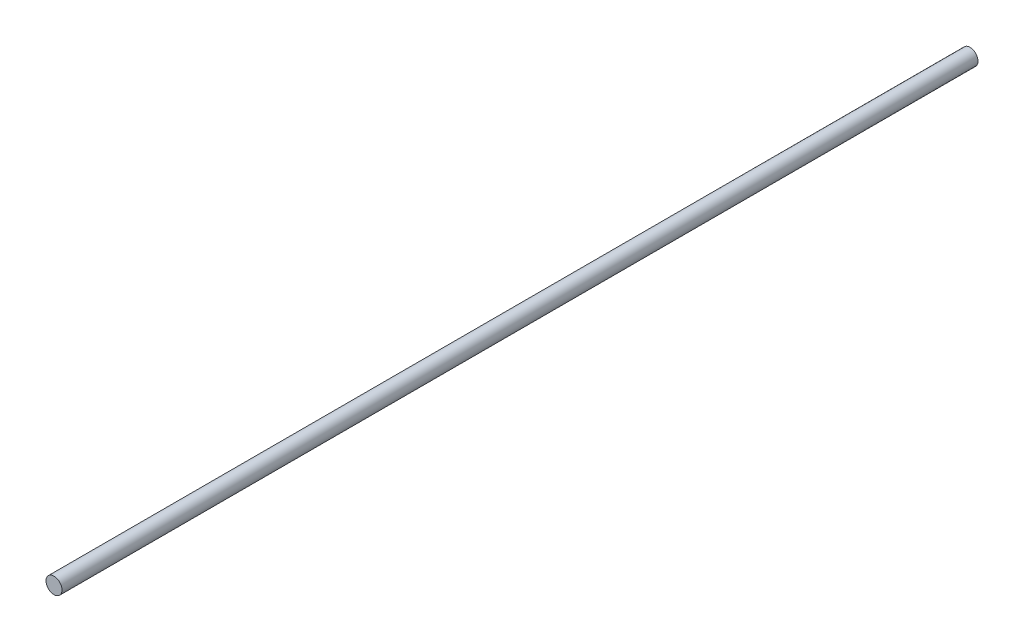
ISO-10303-21;
HEADER;
FILE_DESCRIPTION(('STEP AP214'),'2;1');
FILE_NAME('part.step','',(''),(''),'','','');
FILE_SCHEMA(('AUTOMOTIVE_DESIGN { 1 0 10303 214 1 1 1 1 }'));
ENDSEC;
DATA;
#1=APPLICATION_CONTEXT('core data for automotive mechanical design processes');
#2=APPLICATION_PROTOCOL_DEFINITION('international standard','automotive_design',2000,#1);
#3=PRODUCT_CONTEXT('',#1,'mechanical');
#4=PRODUCT('Part','Part','',(#3));
#5=PRODUCT_RELATED_PRODUCT_CATEGORY('part','',(#4));
#6=PRODUCT_DEFINITION_FORMATION('','',#4);
#7=PRODUCT_DEFINITION_CONTEXT('part definition',#1,'design');
#8=PRODUCT_DEFINITION('design','',#6,#7);
#9=PRODUCT_DEFINITION_SHAPE('','',#8);
#10=(LENGTH_UNIT() NAMED_UNIT(*) SI_UNIT(.MILLI.,.METRE.));
#11=(NAMED_UNIT(*) PLANE_ANGLE_UNIT() SI_UNIT($,.RADIAN.));
#12=(NAMED_UNIT(*) SI_UNIT($,.STERADIAN.) SOLID_ANGLE_UNIT());
#13=UNCERTAINTY_MEASURE_WITH_UNIT(LENGTH_MEASURE(1.E-05),#10,'distance_accuracy_value','');
#14=(GEOMETRIC_REPRESENTATION_CONTEXT(3) GLOBAL_UNCERTAINTY_ASSIGNED_CONTEXT((#13)) GLOBAL_UNIT_ASSIGNED_CONTEXT((#10,
#11,#12)) REPRESENTATION_CONTEXT('',''));
#15=CARTESIAN_POINT('',(0.,0.,0.));
#16=DIRECTION('',(0.,0.,1.));
#17=DIRECTION('',(1.,0.,0.));
#18=AXIS2_PLACEMENT_3D('',#15,#16,#17);
#19=CARTESIAN_POINT('',(0.,0.,100.));
#20=DIRECTION('',(0.,0.,-1.));
#21=DIRECTION('',(-1.,0.,0.));
#22=AXIS2_PLACEMENT_3D('',#19,#20,#21);
#23=CYLINDRICAL_SURFACE('',#22,0.875);
#24=CARTESIAN_POINT('',(0.,0.,100.));
#25=DIRECTION('',(0.,0.,1.));
#26=DIRECTION('',(1.,0.,0.));
#27=AXIS2_PLACEMENT_3D('',#24,#25,#26);
#28=CIRCLE('',#27,0.875);
#29=CARTESIAN_POINT('',(0.875,0.,100.));
#30=VERTEX_POINT('',#29);
#31=EDGE_CURVE('E10',#30,#30,#28,.T.);
#32=ORIENTED_EDGE('',*,*,#31,.F.);
#33=EDGE_LOOP('',(#32));
#34=FACE_BOUND('',#33,.T.);
#35=CARTESIAN_POINT('',(0.,0.,0.));
#36=DIRECTION('',(0.,0.,1.));
#37=DIRECTION('',(1.,0.,0.));
#38=AXIS2_PLACEMENT_3D('',#35,#36,#37);
#39=CIRCLE('',#38,0.875);
#40=CARTESIAN_POINT('',(0.875,0.,0.));
#41=VERTEX_POINT('',#40);
#42=EDGE_CURVE('E33',#41,#41,#39,.T.);
#43=ORIENTED_EDGE('',*,*,#42,.T.);
#44=EDGE_LOOP('',(#43));
#45=FACE_BOUND('',#44,.T.);
#46=ADVANCED_FACE('F30',(#34,#45),#23,.T.);
#47=CARTESIAN_POINT('',(0.,0.,100.));
#48=DIRECTION('',(0.,0.,1.));
#49=DIRECTION('',(1.,0.,0.));
#50=AXIS2_PLACEMENT_3D('',#47,#48,#49);
#51=PLANE('',#50);
#52=ORIENTED_EDGE('',*,*,#31,.T.);
#53=EDGE_LOOP('',(#52));
#54=FACE_BOUND('',#53,.T.);
#55=ADVANCED_FACE('F45',(#54),#51,.T.);
#56=CARTESIAN_POINT('',(0.,0.,0.));
#57=DIRECTION('',(0.,0.,1.));
#58=DIRECTION('',(1.,0.,0.));
#59=AXIS2_PLACEMENT_3D('',#56,#57,#58);
#60=PLANE('',#59);
#61=ORIENTED_EDGE('',*,*,#42,.F.);
#62=EDGE_LOOP('',(#61));
#63=FACE_BOUND('',#62,.T.);
#64=ADVANCED_FACE('F43',(#63),#60,.F.);
#65=CLOSED_SHELL('',(#46,#55,#64));
#66=MANIFOLD_SOLID_BREP('B2',#65);
#67=ADVANCED_BREP_SHAPE_REPRESENTATION('',(#18,#66),#14);
#68=SHAPE_DEFINITION_REPRESENTATION(#9,#67);
ENDSEC;
END-ISO-10303-21;
